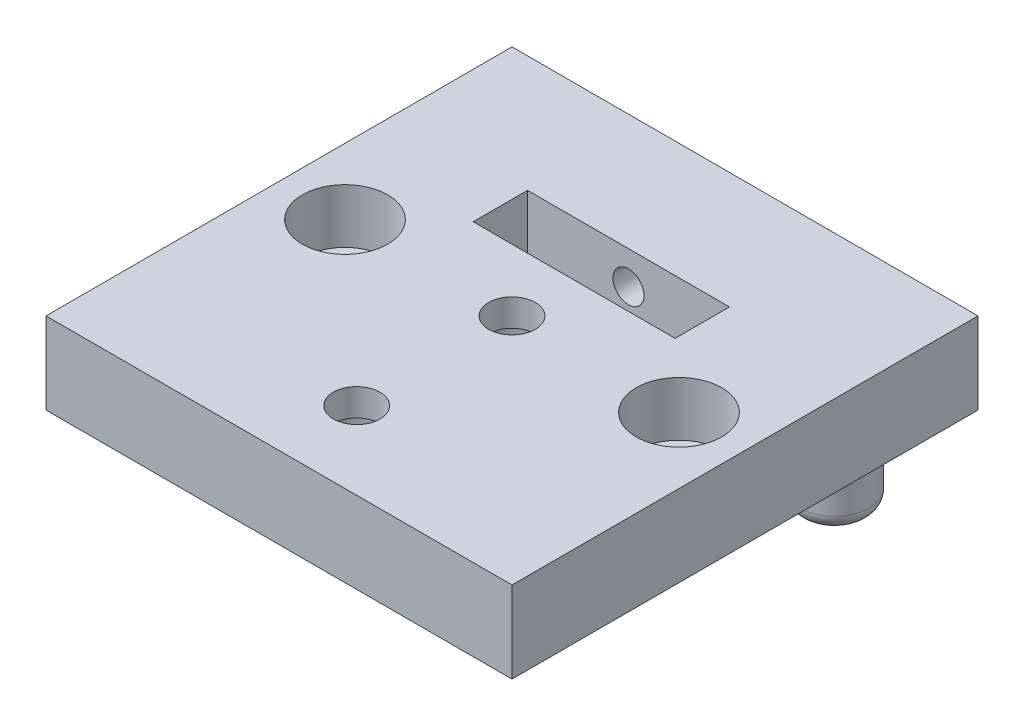
ISO-10303-21;
HEADER;
FILE_DESCRIPTION(('STEP AP214'),'2;1');
FILE_NAME('part.step','',(''),(''),'','','');
FILE_SCHEMA(('AUTOMOTIVE_DESIGN { 1 0 10303 214 1 1 1 1 }'));
ENDSEC;
DATA;
#1=APPLICATION_CONTEXT('core data for automotive mechanical design processes');
#2=APPLICATION_PROTOCOL_DEFINITION('international standard','automotive_design',2000,#1);
#3=PRODUCT_CONTEXT('',#1,'mechanical');
#4=PRODUCT('Part','Part','',(#3));
#5=PRODUCT_RELATED_PRODUCT_CATEGORY('part','',(#4));
#6=PRODUCT_DEFINITION_FORMATION('','',#4);
#7=PRODUCT_DEFINITION_CONTEXT('part definition',#1,'design');
#8=PRODUCT_DEFINITION('design','',#6,#7);
#9=PRODUCT_DEFINITION_SHAPE('','',#8);
#10=(LENGTH_UNIT() NAMED_UNIT(*) SI_UNIT(.MILLI.,.METRE.));
#11=(NAMED_UNIT(*) PLANE_ANGLE_UNIT() SI_UNIT($,.RADIAN.));
#12=(NAMED_UNIT(*) SI_UNIT($,.STERADIAN.) SOLID_ANGLE_UNIT());
#13=UNCERTAINTY_MEASURE_WITH_UNIT(LENGTH_MEASURE(1.E-05),#10,'distance_accuracy_value','');
#14=(GEOMETRIC_REPRESENTATION_CONTEXT(3) GLOBAL_UNCERTAINTY_ASSIGNED_CONTEXT((#13)) GLOBAL_UNIT_ASSIGNED_CONTEXT((#10,
#11,#12)) REPRESENTATION_CONTEXT('',''));
#15=CARTESIAN_POINT('',(0.,0.,0.));
#16=DIRECTION('',(0.,0.,1.));
#17=DIRECTION('',(1.,0.,0.));
#18=AXIS2_PLACEMENT_3D('',#15,#16,#17);
#19=CARTESIAN_POINT('',(0.,16.65,0.));
#20=DIRECTION('',(0.,-1.,0.));
#21=DIRECTION('',(0.,0.,-1.));
#22=AXIS2_PLACEMENT_3D('',#19,#20,#21);
#23=PLANE('',#22);
#24=CARTESIAN_POINT('',(10.75,16.65,-1.));
#25=DIRECTION('',(0.,-1.,0.));
#26=DIRECTION('',(0.,0.,-1.));
#27=AXIS2_PLACEMENT_3D('',#24,#25,#26);
#28=CIRCLE('',#27,2.25);
#29=CARTESIAN_POINT('',(10.75,16.65,1.25));
#30=VERTEX_POINT('',#29);
#31=EDGE_CURVE('E163',#30,#30,#28,.T.);
#32=ORIENTED_EDGE('',*,*,#31,.F.);
#33=EDGE_LOOP('',(#32));
#34=FACE_BOUND('',#33,.T.);
#35=CARTESIAN_POINT('',(-10.75,16.65,-1.));
#36=DIRECTION('',(0.,-1.,0.));
#37=DIRECTION('',(0.,0.,-1.));
#38=AXIS2_PLACEMENT_3D('',#35,#36,#37);
#39=CIRCLE('',#38,2.25);
#40=CARTESIAN_POINT('',(-10.75,16.65,1.25));
#41=VERTEX_POINT('',#40);
#42=EDGE_CURVE('E159',#41,#41,#39,.T.);
#43=ORIENTED_EDGE('',*,*,#42,.F.);
#44=EDGE_LOOP('',(#43));
#45=FACE_BOUND('',#44,.T.);
#46=DIRECTION('',(1.,0.,0.));
#47=VECTOR('',#46,1.);
#48=CARTESIAN_POINT('',(-26.7199111979548,16.65,24.));
#49=LINE('',#48,#47);
#50=CARTESIAN_POINT('',(-15.,16.65,24.));
#51=VERTEX_POINT('',#50);
#52=CARTESIAN_POINT('',(15.,16.65,24.));
#53=VERTEX_POINT('',#52);
#54=EDGE_CURVE('E55',#51,#53,#49,.T.);
#55=ORIENTED_EDGE('',*,*,#54,.F.);
#56=DIRECTION('',(0.,0.,1.));
#57=VECTOR('',#56,1.);
#58=CARTESIAN_POINT('',(-15.,16.65,1.5));
#59=LINE('',#58,#57);
#60=CARTESIAN_POINT('',(-15.,16.65,-6.));
#61=VERTEX_POINT('',#60);
#62=EDGE_CURVE('E158',#61,#51,#59,.T.);
#63=ORIENTED_EDGE('',*,*,#62,.F.);
#64=DIRECTION('',(1.,0.,0.));
#65=VECTOR('',#64,1.);
#66=CARTESIAN_POINT('',(0.,16.65,-6.));
#67=LINE('',#66,#65);
#68=CARTESIAN_POINT('',(15.,16.65,-6.));
#69=VERTEX_POINT('',#68);
#70=EDGE_CURVE('E132',#61,#69,#67,.T.);
#71=ORIENTED_EDGE('',*,*,#70,.T.);
#72=DIRECTION('',(0.,0.,1.));
#73=VECTOR('',#72,1.);
#74=CARTESIAN_POINT('',(15.,16.65,1.5));
#75=LINE('',#74,#73);
#76=EDGE_CURVE('E133',#69,#53,#75,.T.);
#77=ORIENTED_EDGE('',*,*,#76,.T.);
#78=EDGE_LOOP('',(#55,#63,#71,#77));
#79=FACE_BOUND('',#78,.T.);
#80=CARTESIAN_POINT('',(-10.7500000000011,16.65,8.9999999999896));
#81=DIRECTION('',(0.,-1.,0.));
#82=DIRECTION('',(0.,0.,-1.));
#83=AXIS2_PLACEMENT_3D('',#80,#81,#82);
#84=CIRCLE('',#83,1.5);
#85=CARTESIAN_POINT('',(-10.7500000000011,16.65,7.4999999999896));
#86=VERTEX_POINT('',#85);
#87=EDGE_CURVE('E138',#86,#86,#84,.F.);
#88=ORIENTED_EDGE('',*,*,#87,.T.);
#89=EDGE_LOOP('',(#88));
#90=FACE_BOUND('',#89,.T.);
#91=DIRECTION('',(0.,0.,1.));
#92=VECTOR('',#91,1.);
#93=CARTESIAN_POINT('',(6.5,16.65,1.5));
#94=LINE('',#93,#92);
#95=CARTESIAN_POINT('',(6.5,16.65,1.5));
#96=VERTEX_POINT('',#95);
#97=CARTESIAN_POINT('',(6.5,16.65,5.));
#98=VERTEX_POINT('',#97);
#99=EDGE_CURVE('E63',#96,#98,#94,.T.);
#100=ORIENTED_EDGE('',*,*,#99,.F.);
#101=DIRECTION('',(1.,0.,0.));
#102=VECTOR('',#101,1.);
#103=CARTESIAN_POINT('',(0.,16.65,1.5));
#104=LINE('',#103,#102);
#105=CARTESIAN_POINT('',(-6.5,16.65,1.5));
#106=VERTEX_POINT('',#105);
#107=EDGE_CURVE('E130',#106,#96,#104,.T.);
#108=ORIENTED_EDGE('',*,*,#107,.F.);
#109=DIRECTION('',(0.,0.,1.));
#110=VECTOR('',#109,1.);
#111=CARTESIAN_POINT('',(-6.5,16.65,1.5));
#112=LINE('',#111,#110);
#113=CARTESIAN_POINT('',(-6.5,16.65,5.));
#114=VERTEX_POINT('',#113);
#115=EDGE_CURVE('E120',#106,#114,#112,.T.);
#116=ORIENTED_EDGE('',*,*,#115,.T.);
#117=DIRECTION('',(1.,0.,0.));
#118=VECTOR('',#117,1.);
#119=CARTESIAN_POINT('',(-15.,16.65,5.));
#120=LINE('',#119,#118);
#121=EDGE_CURVE('E105',#114,#98,#120,.T.);
#122=ORIENTED_EDGE('',*,*,#121,.T.);
#123=EDGE_LOOP('',(#100,#108,#116,#122));
#124=FACE_BOUND('',#123,.T.);
#125=CARTESIAN_POINT('',(10.7500000000011,16.65,8.9999999999896));
#126=DIRECTION('',(0.,-1.,0.));
#127=DIRECTION('',(0.,0.,-1.));
#128=AXIS2_PLACEMENT_3D('',#125,#126,#127);
#129=CIRCLE('',#128,1.5);
#130=CARTESIAN_POINT('',(10.7500000000011,16.65,7.4999999999896));
#131=VERTEX_POINT('',#130);
#132=EDGE_CURVE('E140',#131,#131,#129,.F.);
#133=ORIENTED_EDGE('',*,*,#132,.T.);
#134=EDGE_LOOP('',(#133));
#135=FACE_BOUND('',#134,.T.);
#136=CARTESIAN_POINT('',(0.,16.65,19.));
#137=DIRECTION('',(0.,-1.,0.));
#138=DIRECTION('',(0.,0.,-1.));
#139=AXIS2_PLACEMENT_3D('',#136,#137,#138);
#140=CIRCLE('',#139,2.75);
#141=CARTESIAN_POINT('',(0.,16.65,16.25));
#142=VERTEX_POINT('',#141);
#143=EDGE_CURVE('E258',#142,#142,#140,.T.);
#144=ORIENTED_EDGE('',*,*,#143,.F.);
#145=EDGE_LOOP('',(#144));
#146=FACE_BOUND('',#145,.T.);
#147=CARTESIAN_POINT('',(1.04999478503709E-13,16.65,9.));
#148=DIRECTION('',(0.,-1.,0.));
#149=DIRECTION('',(0.,0.,-1.));
#150=AXIS2_PLACEMENT_3D('',#147,#148,#149);
#151=CIRCLE('',#150,2.75);
#152=CARTESIAN_POINT('',(1.04999478503709E-13,16.65,6.25));
#153=VERTEX_POINT('',#152);
#154=EDGE_CURVE('E261',#153,#153,#151,.T.);
#155=ORIENTED_EDGE('',*,*,#154,.F.);
#156=EDGE_LOOP('',(#155));
#157=FACE_BOUND('',#156,.T.);
#158=ADVANCED_FACE('F39',(#34,#45,#79,#90,#124,#135,#146,#157),#23,.T.);
#159=CARTESIAN_POINT('',(0.,0.,0.));
#160=DIRECTION('',(0.,0.,1.));
#161=DIRECTION('',(1.,0.,0.));
#162=AXIS2_PLACEMENT_3D('',#159,#160,#161);
#163=PLANE('',#162);
#164=CARTESIAN_POINT('',(0.,19.775,0.));
#165=DIRECTION('',(0.,0.,1.));
#166=DIRECTION('',(1.,0.,0.));
#167=AXIS2_PLACEMENT_3D('',#164,#165,#166);
#168=CIRCLE('',#167,1.);
#169=CARTESIAN_POINT('',(1.,19.775,0.));
#170=VERTEX_POINT('',#169);
#171=EDGE_CURVE('E347',#170,#170,#168,.F.);
#172=ORIENTED_EDGE('',*,*,#171,.F.);
#173=EDGE_LOOP('',(#172));
#174=FACE_BOUND('',#173,.T.);
#175=ADVANCED_FACE('F191',(#174),#163,.T.);
#176=CARTESIAN_POINT('',(1.04999478503709E-13,26.1426406871193,9.));
#177=DIRECTION('',(0.,-1.,0.));
#178=DIRECTION('',(0.,0.,-1.));
#179=AXIS2_PLACEMENT_3D('',#176,#177,#178);
#180=CYLINDRICAL_SURFACE('',#179,1.5);
#181=CARTESIAN_POINT('',(1.04999478503709E-13,20.15,9.));
#182=DIRECTION('',(0.,-1.,0.));
#183=DIRECTION('',(0.,0.,-1.));
#184=AXIS2_PLACEMENT_3D('',#181,#182,#183);
#185=CIRCLE('',#184,1.5);
#186=CARTESIAN_POINT('',(1.04999478503709E-13,20.15,7.5));
#187=VERTEX_POINT('',#186);
#188=EDGE_CURVE('E288',#187,#187,#185,.T.);
#189=ORIENTED_EDGE('',*,*,#188,.T.);
#190=EDGE_LOOP('',(#189));
#191=FACE_BOUND('',#190,.T.);
#192=CARTESIAN_POINT('',(1.04999478503709E-13,21.9,9.));
#193=DIRECTION('',(0.,1.,0.));
#194=DIRECTION('',(0.,0.,1.));
#195=AXIS2_PLACEMENT_3D('',#192,#193,#194);
#196=CIRCLE('',#195,1.5);
#197=CARTESIAN_POINT('',(1.04999478503709E-13,21.9,10.5));
#198=VERTEX_POINT('',#197);
#199=EDGE_CURVE('E284',#198,#198,#196,.F.);
#200=ORIENTED_EDGE('',*,*,#199,.F.);
#201=EDGE_LOOP('',(#200));
#202=FACE_BOUND('',#201,.T.);
#203=ADVANCED_FACE('F193',(#191,#202),#180,.F.);
#204=CARTESIAN_POINT('',(1.04999478503709E-13,20.15,9.));
#205=DIRECTION('',(0.,-1.,0.));
#206=DIRECTION('',(0.,0.,-1.));
#207=AXIS2_PLACEMENT_3D('',#204,#205,#206);
#208=PLANE('',#207);
#209=ORIENTED_EDGE('',*,*,#188,.F.);
#210=EDGE_LOOP('',(#209));
#211=FACE_BOUND('',#210,.T.);
#212=CARTESIAN_POINT('',(1.04999478503709E-13,20.15,9.));
#213=DIRECTION('',(0.,-1.,0.));
#214=DIRECTION('',(0.,0.,-1.));
#215=AXIS2_PLACEMENT_3D('',#212,#213,#214);
#216=CIRCLE('',#215,2.75);
#217=CARTESIAN_POINT('',(1.04999478503709E-13,20.15,6.25));
#218=VERTEX_POINT('',#217);
#219=EDGE_CURVE('E265',#218,#218,#216,.T.);
#220=ORIENTED_EDGE('',*,*,#219,.T.);
#221=EDGE_LOOP('',(#220));
#222=FACE_BOUND('',#221,.T.);
#223=ADVANCED_FACE('F200',(#211,#222),#208,.T.);
#224=CARTESIAN_POINT('',(1.04999478503709E-13,20.15,9.));
#225=DIRECTION('',(0.,-1.,0.));
#226=DIRECTION('',(0.,0.,-1.));
#227=AXIS2_PLACEMENT_3D('',#224,#225,#226);
#228=CYLINDRICAL_SURFACE('',#227,2.75);
#229=ORIENTED_EDGE('',*,*,#219,.F.);
#230=EDGE_LOOP('',(#229));
#231=FACE_BOUND('',#230,.T.);
#232=ORIENTED_EDGE('',*,*,#154,.T.);
#233=EDGE_LOOP('',(#232));
#234=FACE_BOUND('',#233,.T.);
#235=ADVANCED_FACE('F412',(#231,#234),#228,.F.);
#236=CARTESIAN_POINT('',(0.,26.1426406871193,19.));
#237=DIRECTION('',(0.,-1.,0.));
#238=DIRECTION('',(0.,0.,-1.));
#239=AXIS2_PLACEMENT_3D('',#236,#237,#238);
#240=CYLINDRICAL_SURFACE('',#239,1.5);
#241=CARTESIAN_POINT('',(0.,20.15,19.));
#242=DIRECTION('',(0.,-1.,0.));
#243=DIRECTION('',(0.,0.,-1.));
#244=AXIS2_PLACEMENT_3D('',#241,#242,#243);
#245=CIRCLE('',#244,1.5);
#246=CARTESIAN_POINT('',(0.,20.15,17.5));
#247=VERTEX_POINT('',#246);
#248=EDGE_CURVE('E270',#247,#247,#245,.T.);
#249=ORIENTED_EDGE('',*,*,#248,.T.);
#250=EDGE_LOOP('',(#249));
#251=FACE_BOUND('',#250,.T.);
#252=CARTESIAN_POINT('',(0.,21.9,19.));
#253=DIRECTION('',(0.,1.,0.));
#254=DIRECTION('',(0.,0.,1.));
#255=AXIS2_PLACEMENT_3D('',#252,#253,#254);
#256=CIRCLE('',#255,1.5);
#257=CARTESIAN_POINT('',(0.,21.9,20.5));
#258=VERTEX_POINT('',#257);
#259=EDGE_CURVE('E264',#258,#258,#256,.F.);
#260=ORIENTED_EDGE('',*,*,#259,.F.);
#261=EDGE_LOOP('',(#260));
#262=FACE_BOUND('',#261,.T.);
#263=ADVANCED_FACE('F415',(#251,#262),#240,.F.);
#264=CARTESIAN_POINT('',(0.,20.15,19.));
#265=DIRECTION('',(0.,-1.,0.));
#266=DIRECTION('',(0.,0.,-1.));
#267=AXIS2_PLACEMENT_3D('',#264,#265,#266);
#268=PLANE('',#267);
#269=ORIENTED_EDGE('',*,*,#248,.F.);
#270=EDGE_LOOP('',(#269));
#271=FACE_BOUND('',#270,.T.);
#272=CARTESIAN_POINT('',(0.,20.15,19.));
#273=DIRECTION('',(0.,-1.,0.));
#274=DIRECTION('',(0.,0.,-1.));
#275=AXIS2_PLACEMENT_3D('',#272,#273,#274);
#276=CIRCLE('',#275,2.75);
#277=CARTESIAN_POINT('',(0.,20.15,16.25));
#278=VERTEX_POINT('',#277);
#279=EDGE_CURVE('E280',#278,#278,#276,.T.);
#280=ORIENTED_EDGE('',*,*,#279,.T.);
#281=EDGE_LOOP('',(#280));
#282=FACE_BOUND('',#281,.T.);
#283=ADVANCED_FACE('F423',(#271,#282),#268,.T.);
#284=CARTESIAN_POINT('',(0.,20.15,19.));
#285=DIRECTION('',(0.,-1.,0.));
#286=DIRECTION('',(0.,0.,-1.));
#287=AXIS2_PLACEMENT_3D('',#284,#285,#286);
#288=CYLINDRICAL_SURFACE('',#287,2.75);
#289=ORIENTED_EDGE('',*,*,#279,.F.);
#290=EDGE_LOOP('',(#289));
#291=FACE_BOUND('',#290,.T.);
#292=ORIENTED_EDGE('',*,*,#143,.T.);
#293=EDGE_LOOP('',(#292));
#294=FACE_BOUND('',#293,.T.);
#295=ADVANCED_FACE('F420',(#291,#294),#288,.F.);
#296=CARTESIAN_POINT('',(10.7500000000011,18.4,8.9999999999896));
#297=DIRECTION('',(0.,1.,0.));
#298=DIRECTION('',(0.,0.,1.));
#299=AXIS2_PLACEMENT_3D('',#296,#297,#298);
#300=CYLINDRICAL_SURFACE('',#299,2.75);
#301=CARTESIAN_POINT('',(10.7500000000011,18.4,8.9999999999896));
#302=DIRECTION('',(0.,1.,0.));
#303=DIRECTION('',(0.,0.,-1.));
#304=AXIS2_PLACEMENT_3D('',#301,#302,#303);
#305=CIRCLE('',#304,2.75);
#306=CARTESIAN_POINT('',(10.7500000000011,18.4,6.2499999999896));
#307=VERTEX_POINT('',#306);
#308=EDGE_CURVE('E298',#307,#307,#305,.T.);
#309=ORIENTED_EDGE('',*,*,#308,.F.);
#310=EDGE_LOOP('',(#309));
#311=FACE_BOUND('',#310,.T.);
#312=CARTESIAN_POINT('',(10.7500000000011,21.9,8.9999999999896));
#313=DIRECTION('',(0.,1.,0.));
#314=DIRECTION('',(0.,0.,-1.));
#315=AXIS2_PLACEMENT_3D('',#312,#313,#314);
#316=CIRCLE('',#315,2.75);
#317=CARTESIAN_POINT('',(10.7500000000011,21.9,6.2499999999896));
#318=VERTEX_POINT('',#317);
#319=EDGE_CURVE('E164',#318,#318,#316,.T.);
#320=ORIENTED_EDGE('',*,*,#319,.T.);
#321=EDGE_LOOP('',(#320));
#322=FACE_BOUND('',#321,.T.);
#323=ADVANCED_FACE('F246',(#311,#322),#300,.F.);
#324=CARTESIAN_POINT('',(10.7500000000011,18.4,8.9999999999896));
#325=DIRECTION('',(0.,-1.,0.));
#326=DIRECTION('',(0.,0.,-1.));
#327=AXIS2_PLACEMENT_3D('',#324,#325,#326);
#328=PLANE('',#327);
#329=ORIENTED_EDGE('',*,*,#308,.T.);
#330=EDGE_LOOP('',(#329));
#331=FACE_BOUND('',#330,.T.);
#332=CARTESIAN_POINT('',(10.7500000000011,18.4,8.9999999999896));
#333=DIRECTION('',(0.,-1.,0.));
#334=DIRECTION('',(0.,0.,-1.));
#335=AXIS2_PLACEMENT_3D('',#332,#333,#334);
#336=CIRCLE('',#335,1.5);
#337=CARTESIAN_POINT('',(10.7500000000011,18.4,7.4999999999896));
#338=VERTEX_POINT('',#337);
#339=EDGE_CURVE('E252',#338,#338,#336,.F.);
#340=ORIENTED_EDGE('',*,*,#339,.F.);
#341=EDGE_LOOP('',(#340));
#342=FACE_BOUND('',#341,.T.);
#343=ADVANCED_FACE('F238',(#331,#342),#328,.F.);
#344=CARTESIAN_POINT('',(10.7500000000011,26.1426406871193,8.9999999999896));
#345=DIRECTION('',(0.,-1.,0.));
#346=DIRECTION('',(0.,0.,-1.));
#347=AXIS2_PLACEMENT_3D('',#344,#345,#346);
#348=CYLINDRICAL_SURFACE('',#347,1.5);
#349=ORIENTED_EDGE('',*,*,#339,.T.);
#350=EDGE_LOOP('',(#349));
#351=FACE_BOUND('',#350,.T.);
#352=ORIENTED_EDGE('',*,*,#132,.F.);
#353=EDGE_LOOP('',(#352));
#354=FACE_BOUND('',#353,.T.);
#355=ADVANCED_FACE('F236',(#351,#354),#348,.F.);
#356=CARTESIAN_POINT('',(-10.7500000000011,18.4,8.9999999999896));
#357=DIRECTION('',(0.,1.,0.));
#358=DIRECTION('',(0.,0.,1.));
#359=AXIS2_PLACEMENT_3D('',#356,#357,#358);
#360=CYLINDRICAL_SURFACE('',#359,2.75);
#361=CARTESIAN_POINT('',(-10.7500000000011,18.4,8.9999999999896));
#362=DIRECTION('',(0.,1.,0.));
#363=DIRECTION('',(0.,0.,1.));
#364=AXIS2_PLACEMENT_3D('',#361,#362,#363);
#365=CIRCLE('',#364,2.75);
#366=CARTESIAN_POINT('',(-10.7500000000011,18.4,11.7499999999896));
#367=VERTEX_POINT('',#366);
#368=EDGE_CURVE('E306',#367,#367,#365,.T.);
#369=ORIENTED_EDGE('',*,*,#368,.F.);
#370=EDGE_LOOP('',(#369));
#371=FACE_BOUND('',#370,.T.);
#372=CARTESIAN_POINT('',(-10.7500000000011,21.9,8.9999999999896));
#373=DIRECTION('',(0.,1.,0.));
#374=DIRECTION('',(0.,0.,1.));
#375=AXIS2_PLACEMENT_3D('',#372,#373,#374);
#376=CIRCLE('',#375,2.75);
#377=CARTESIAN_POINT('',(-10.7500000000011,21.9,11.7499999999896));
#378=VERTEX_POINT('',#377);
#379=EDGE_CURVE('E302',#378,#378,#376,.T.);
#380=ORIENTED_EDGE('',*,*,#379,.T.);
#381=EDGE_LOOP('',(#380));
#382=FACE_BOUND('',#381,.T.);
#383=ADVANCED_FACE('F220',(#371,#382),#360,.F.);
#384=CARTESIAN_POINT('',(0.,0.,-6.));
#385=DIRECTION('',(0.,0.,1.));
#386=DIRECTION('',(1.,0.,0.));
#387=AXIS2_PLACEMENT_3D('',#384,#385,#386);
#388=PLANE('',#387);
#389=ORIENTED_EDGE('',*,*,#70,.F.);
#390=DIRECTION('',(0.,1.,0.));
#391=VECTOR('',#390,1.);
#392=CARTESIAN_POINT('',(-15.,-10.6,-6.));
#393=LINE('',#392,#391);
#394=CARTESIAN_POINT('',(-15.,21.9,-6.));
#395=VERTEX_POINT('',#394);
#396=EDGE_CURVE('E147',#61,#395,#393,.T.);
#397=ORIENTED_EDGE('',*,*,#396,.T.);
#398=DIRECTION('',(1.,0.,0.));
#399=VECTOR('',#398,1.);
#400=CARTESIAN_POINT('',(15.,21.9,-6.));
#401=LINE('',#400,#399);
#402=CARTESIAN_POINT('',(15.,21.9,-6.));
#403=VERTEX_POINT('',#402);
#404=EDGE_CURVE('E151',#395,#403,#401,.T.);
#405=ORIENTED_EDGE('',*,*,#404,.T.);
#406=DIRECTION('',(0.,-1.,0.));
#407=VECTOR('',#406,1.);
#408=CARTESIAN_POINT('',(15.,-10.6,-6.));
#409=LINE('',#408,#407);
#410=EDGE_CURVE('E150',#403,#69,#409,.T.);
#411=ORIENTED_EDGE('',*,*,#410,.T.);
#412=EDGE_LOOP('',(#389,#397,#405,#411));
#413=FACE_BOUND('',#412,.T.);
#414=ADVANCED_FACE('F216',(#413),#388,.F.);
#415=CARTESIAN_POINT('',(0.,21.9,1.5));
#416=DIRECTION('',(0.,1.,0.));
#417=DIRECTION('',(0.,0.,1.));
#418=AXIS2_PLACEMENT_3D('',#415,#416,#417);
#419=PLANE('',#418);
#420=ORIENTED_EDGE('',*,*,#379,.F.);
#421=EDGE_LOOP('',(#420));
#422=FACE_BOUND('',#421,.T.);
#423=ORIENTED_EDGE('',*,*,#319,.F.);
#424=EDGE_LOOP('',(#423));
#425=FACE_BOUND('',#424,.T.);
#426=ORIENTED_EDGE('',*,*,#259,.T.);
#427=EDGE_LOOP('',(#426));
#428=FACE_BOUND('',#427,.T.);
#429=ORIENTED_EDGE('',*,*,#199,.T.);
#430=EDGE_LOOP('',(#429));
#431=FACE_BOUND('',#430,.T.);
#432=DIRECTION('',(0.,0.,-1.));
#433=VECTOR('',#432,1.);
#434=CARTESIAN_POINT('',(-15.,21.9,1.5));
#435=LINE('',#434,#433);
#436=CARTESIAN_POINT('',(-15.,21.9,24.));
#437=VERTEX_POINT('',#436);
#438=EDGE_CURVE('E342',#437,#395,#435,.T.);
#439=ORIENTED_EDGE('',*,*,#438,.F.);
#440=DIRECTION('',(-1.,0.,0.));
#441=VECTOR('',#440,1.);
#442=CARTESIAN_POINT('',(-15.,21.9,24.));
#443=LINE('',#442,#441);
#444=CARTESIAN_POINT('',(15.,21.9,24.));
#445=VERTEX_POINT('',#444);
#446=EDGE_CURVE('E371',#445,#437,#443,.T.);
#447=ORIENTED_EDGE('',*,*,#446,.F.);
#448=DIRECTION('',(0.,0.,-1.));
#449=VECTOR('',#448,1.);
#450=CARTESIAN_POINT('',(15.,21.9,1.5));
#451=LINE('',#450,#449);
#452=EDGE_CURVE('E157',#445,#403,#451,.T.);
#453=ORIENTED_EDGE('',*,*,#452,.T.);
#454=ORIENTED_EDGE('',*,*,#404,.F.);
#455=EDGE_LOOP('',(#439,#447,#453,#454));
#456=FACE_BOUND('',#455,.T.);
#457=DIRECTION('',(-1.,0.,0.));
#458=VECTOR('',#457,1.);
#459=CARTESIAN_POINT('',(-15.,21.9,5.));
#460=LINE('',#459,#458);
#461=CARTESIAN_POINT('',(6.5,21.9,5.));
#462=VERTEX_POINT('',#461);
#463=CARTESIAN_POINT('',(-6.5,21.9,5.));
#464=VERTEX_POINT('',#463);
#465=EDGE_CURVE('E115',#462,#464,#460,.T.);
#466=ORIENTED_EDGE('',*,*,#465,.T.);
#467=DIRECTION('',(0.,0.,-1.));
#468=VECTOR('',#467,1.);
#469=CARTESIAN_POINT('',(-6.5,21.9,5.));
#470=LINE('',#469,#468);
#471=CARTESIAN_POINT('',(-6.5,21.9,1.5));
#472=VERTEX_POINT('',#471);
#473=EDGE_CURVE('E123',#464,#472,#470,.T.);
#474=ORIENTED_EDGE('',*,*,#473,.T.);
#475=DIRECTION('',(1.,0.,0.));
#476=VECTOR('',#475,1.);
#477=CARTESIAN_POINT('',(0.,21.9,1.5));
#478=LINE('',#477,#476);
#479=CARTESIAN_POINT('',(6.5,21.9,1.5));
#480=VERTEX_POINT('',#479);
#481=EDGE_CURVE('E351',#472,#480,#478,.T.);
#482=ORIENTED_EDGE('',*,*,#481,.T.);
#483=DIRECTION('',(0.,0.,-1.));
#484=VECTOR('',#483,1.);
#485=CARTESIAN_POINT('',(6.5,21.9,5.));
#486=LINE('',#485,#484);
#487=EDGE_CURVE('E125',#462,#480,#486,.T.);
#488=ORIENTED_EDGE('',*,*,#487,.F.);
#489=EDGE_LOOP('',(#466,#474,#482,#488));
#490=FACE_BOUND('',#489,.T.);
#491=ADVANCED_FACE('F219',(#422,#425,#428,#431,#456,#490),#419,.T.);
#492=CARTESIAN_POINT('',(15.,0.,1.5));
#493=DIRECTION('',(-1.,0.,0.));
#494=DIRECTION('',(0.,0.,1.));
#495=AXIS2_PLACEMENT_3D('',#492,#493,#494);
#496=PLANE('',#495);
#497=ORIENTED_EDGE('',*,*,#76,.F.);
#498=ORIENTED_EDGE('',*,*,#410,.F.);
#499=ORIENTED_EDGE('',*,*,#452,.F.);
#500=DIRECTION('',(0.,1.,0.));
#501=VECTOR('',#500,1.);
#502=CARTESIAN_POINT('',(15.,21.9,24.));
#503=LINE('',#502,#501);
#504=EDGE_CURVE('E378',#53,#445,#503,.T.);
#505=ORIENTED_EDGE('',*,*,#504,.F.);
#506=EDGE_LOOP('',(#497,#498,#499,#505));
#507=FACE_BOUND('',#506,.T.);
#508=ADVANCED_FACE('F222',(#507),#496,.F.);
#509=CARTESIAN_POINT('',(-15.,0.,1.5));
#510=DIRECTION('',(-1.,0.,0.));
#511=DIRECTION('',(0.,0.,1.));
#512=AXIS2_PLACEMENT_3D('',#509,#510,#511);
#513=PLANE('',#512);
#514=ORIENTED_EDGE('',*,*,#396,.F.);
#515=ORIENTED_EDGE('',*,*,#62,.T.);
#516=DIRECTION('',(0.,-1.,0.));
#517=VECTOR('',#516,1.);
#518=CARTESIAN_POINT('',(-15.,21.9,24.));
#519=LINE('',#518,#517);
#520=EDGE_CURVE('E275',#437,#51,#519,.T.);
#521=ORIENTED_EDGE('',*,*,#520,.F.);
#522=ORIENTED_EDGE('',*,*,#438,.T.);
#523=EDGE_LOOP('',(#514,#515,#521,#522));
#524=FACE_BOUND('',#523,.T.);
#525=ADVANCED_FACE('F225',(#524),#513,.T.);
#526=CARTESIAN_POINT('',(0.,0.,24.));
#527=DIRECTION('',(0.,0.,1.));
#528=DIRECTION('',(1.,0.,0.));
#529=AXIS2_PLACEMENT_3D('',#526,#527,#528);
#530=PLANE('',#529);
#531=ORIENTED_EDGE('',*,*,#520,.T.);
#532=ORIENTED_EDGE('',*,*,#54,.T.);
#533=ORIENTED_EDGE('',*,*,#504,.T.);
#534=ORIENTED_EDGE('',*,*,#446,.T.);
#535=EDGE_LOOP('',(#531,#532,#533,#534));
#536=FACE_BOUND('',#535,.T.);
#537=ADVANCED_FACE('F232',(#536),#530,.T.);
#538=CARTESIAN_POINT('',(-6.5,0.,1.5));
#539=DIRECTION('',(-1.,0.,0.));
#540=DIRECTION('',(0.,0.,1.));
#541=AXIS2_PLACEMENT_3D('',#538,#539,#540);
#542=PLANE('',#541);
#543=ORIENTED_EDGE('',*,*,#115,.F.);
#544=DIRECTION('',(0.,1.,0.));
#545=VECTOR('',#544,1.);
#546=CARTESIAN_POINT('',(-6.5,21.9,1.5));
#547=LINE('',#546,#545);
#548=EDGE_CURVE('E154',#106,#472,#547,.T.);
#549=ORIENTED_EDGE('',*,*,#548,.T.);
#550=ORIENTED_EDGE('',*,*,#473,.F.);
#551=DIRECTION('',(0.,1.,0.));
#552=VECTOR('',#551,1.);
#553=CARTESIAN_POINT('',(-6.5,21.9,5.));
#554=LINE('',#553,#552);
#555=EDGE_CURVE('E109',#114,#464,#554,.T.);
#556=ORIENTED_EDGE('',*,*,#555,.F.);
#557=EDGE_LOOP('',(#543,#549,#550,#556));
#558=FACE_BOUND('',#557,.T.);
#559=ADVANCED_FACE('F118',(#558),#542,.F.);
#560=CARTESIAN_POINT('',(6.5,0.,1.5));
#561=DIRECTION('',(-1.,0.,0.));
#562=DIRECTION('',(0.,0.,1.));
#563=AXIS2_PLACEMENT_3D('',#560,#561,#562);
#564=PLANE('',#563);
#565=DIRECTION('',(0.,-1.,0.));
#566=VECTOR('',#565,1.);
#567=CARTESIAN_POINT('',(6.5,-10.6,1.5));
#568=LINE('',#567,#566);
#569=EDGE_CURVE('E368',#480,#96,#568,.T.);
#570=ORIENTED_EDGE('',*,*,#569,.T.);
#571=ORIENTED_EDGE('',*,*,#99,.T.);
#572=DIRECTION('',(0.,-1.,0.));
#573=VECTOR('',#572,1.);
#574=CARTESIAN_POINT('',(6.5,-10.6,5.));
#575=LINE('',#574,#573);
#576=EDGE_CURVE('E111',#462,#98,#575,.T.);
#577=ORIENTED_EDGE('',*,*,#576,.F.);
#578=ORIENTED_EDGE('',*,*,#487,.T.);
#579=EDGE_LOOP('',(#570,#571,#577,#578));
#580=FACE_BOUND('',#579,.T.);
#581=ADVANCED_FACE('F227',(#580),#564,.T.);
#582=CARTESIAN_POINT('',(0.,0.,5.));
#583=DIRECTION('',(0.,0.,1.));
#584=DIRECTION('',(1.,0.,0.));
#585=AXIS2_PLACEMENT_3D('',#582,#583,#584);
#586=PLANE('',#585);
#587=ORIENTED_EDGE('',*,*,#576,.T.);
#588=ORIENTED_EDGE('',*,*,#121,.F.);
#589=ORIENTED_EDGE('',*,*,#555,.T.);
#590=ORIENTED_EDGE('',*,*,#465,.F.);
#591=EDGE_LOOP('',(#587,#588,#589,#590));
#592=FACE_BOUND('',#591,.T.);
#593=ADVANCED_FACE('F107',(#592),#586,.F.);
#594=CARTESIAN_POINT('',(0.,19.775,1.5));
#595=DIRECTION('',(0.,0.,-1.));
#596=DIRECTION('',(-1.,0.,0.));
#597=AXIS2_PLACEMENT_3D('',#594,#595,#596);
#598=CYLINDRICAL_SURFACE('',#597,1.);
#599=CARTESIAN_POINT('',(0.,19.775,1.5));
#600=DIRECTION('',(0.,0.,1.));
#601=DIRECTION('',(1.,0.,0.));
#602=AXIS2_PLACEMENT_3D('',#599,#600,#601);
#603=CIRCLE('',#602,1.);
#604=CARTESIAN_POINT('',(1.,19.775,1.5));
#605=VERTEX_POINT('',#604);
#606=EDGE_CURVE('E346',#605,#605,#603,.F.);
#607=ORIENTED_EDGE('',*,*,#606,.F.);
#608=EDGE_LOOP('',(#607));
#609=FACE_BOUND('',#608,.T.);
#610=ORIENTED_EDGE('',*,*,#171,.T.);
#611=EDGE_LOOP('',(#610));
#612=FACE_BOUND('',#611,.T.);
#613=ADVANCED_FACE('F214',(#609,#612),#598,.F.);
#614=CARTESIAN_POINT('',(0.,0.,1.5));
#615=DIRECTION('',(0.,0.,1.));
#616=DIRECTION('',(1.,0.,0.));
#617=AXIS2_PLACEMENT_3D('',#614,#615,#616);
#618=PLANE('',#617);
#619=ORIENTED_EDGE('',*,*,#606,.T.);
#620=EDGE_LOOP('',(#619));
#621=FACE_BOUND('',#620,.T.);
#622=ORIENTED_EDGE('',*,*,#107,.T.);
#623=ORIENTED_EDGE('',*,*,#569,.F.);
#624=ORIENTED_EDGE('',*,*,#481,.F.);
#625=ORIENTED_EDGE('',*,*,#548,.F.);
#626=EDGE_LOOP('',(#622,#623,#624,#625));
#627=FACE_BOUND('',#626,.T.);
#628=ADVANCED_FACE('F210',(#621,#627),#618,.T.);
#629=CARTESIAN_POINT('',(-10.7500000000011,18.4,8.9999999999896));
#630=DIRECTION('',(0.,1.,0.));
#631=DIRECTION('',(0.,0.,1.));
#632=AXIS2_PLACEMENT_3D('',#629,#630,#631);
#633=PLANE('',#632);
#634=ORIENTED_EDGE('',*,*,#368,.T.);
#635=EDGE_LOOP('',(#634));
#636=FACE_BOUND('',#635,.T.);
#637=CARTESIAN_POINT('',(-10.7500000000011,18.4,8.9999999999896));
#638=DIRECTION('',(0.,1.,0.));
#639=DIRECTION('',(0.,0.,1.));
#640=AXIS2_PLACEMENT_3D('',#637,#638,#639);
#641=CIRCLE('',#640,1.5);
#642=CARTESIAN_POINT('',(-10.7500000000011,18.4,10.4999999999896));
#643=VERTEX_POINT('',#642);
#644=EDGE_CURVE('E310',#643,#643,#641,.F.);
#645=ORIENTED_EDGE('',*,*,#644,.T.);
#646=EDGE_LOOP('',(#645));
#647=FACE_BOUND('',#646,.T.);
#648=ADVANCED_FACE('F213',(#636,#647),#633,.T.);
#649=CARTESIAN_POINT('',(-10.7500000000011,26.1426406871193,8.9999999999896));
#650=DIRECTION('',(0.,-1.,0.));
#651=DIRECTION('',(0.,0.,-1.));
#652=AXIS2_PLACEMENT_3D('',#649,#650,#651);
#653=CYLINDRICAL_SURFACE('',#652,1.5);
#654=ORIENTED_EDGE('',*,*,#644,.F.);
#655=EDGE_LOOP('',(#654));
#656=FACE_BOUND('',#655,.T.);
#657=ORIENTED_EDGE('',*,*,#87,.F.);
#658=EDGE_LOOP('',(#657));
#659=FACE_BOUND('',#658,.T.);
#660=ADVANCED_FACE('F206',(#656,#659),#653,.F.);
#661=CARTESIAN_POINT('',(-10.75,11.7,-1.));
#662=DIRECTION('',(0.,1.,0.));
#663=DIRECTION('',(0.,0.,1.));
#664=AXIS2_PLACEMENT_3D('',#661,#662,#663);
#665=CYLINDRICAL_SURFACE('',#664,2.25);
#666=CARTESIAN_POINT('',(-10.75,12.7,-1.));
#667=DIRECTION('',(0.,1.,0.));
#668=DIRECTION('',(0.,0.,1.));
#669=AXIS2_PLACEMENT_3D('',#666,#667,#668);
#670=CIRCLE('',#669,2.25);
#671=CARTESIAN_POINT('',(-10.75,12.7,1.25));
#672=VERTEX_POINT('',#671);
#673=EDGE_CURVE('E168',#672,#672,#670,.T.);
#674=CARTESIAN_POINT('',(-10.75,12.7,1.25));
#675=CARTESIAN_POINT('',(-10.75,12.7411458333333,1.25));
#676=CARTESIAN_POINT('',(-10.75,12.7822916666667,1.25));
#677=CARTESIAN_POINT('',(-10.75,12.8645833333333,1.25));
#678=CARTESIAN_POINT('',(-10.75,12.9057291666667,1.25));
#679=CARTESIAN_POINT('',(-10.75,12.9880208333333,1.25));
#680=CARTESIAN_POINT('',(-10.75,13.0291666666667,1.25));
#681=CARTESIAN_POINT('',(-10.75,13.1114583333333,1.25));
#682=CARTESIAN_POINT('',(-10.75,13.1526041666667,1.25));
#683=CARTESIAN_POINT('',(-10.75,13.2348958333333,1.25));
#684=CARTESIAN_POINT('',(-10.75,13.2760416666667,1.25));
#685=CARTESIAN_POINT('',(-10.75,13.3583333333333,1.25));
#686=CARTESIAN_POINT('',(-10.75,13.3994791666667,1.25));
#687=CARTESIAN_POINT('',(-10.75,13.4817708333333,1.25));
#688=CARTESIAN_POINT('',(-10.75,13.5229166666667,1.25));
#689=CARTESIAN_POINT('',(-10.75,13.6052083333333,1.25));
#690=CARTESIAN_POINT('',(-10.75,13.6463541666667,1.25));
#691=CARTESIAN_POINT('',(-10.75,13.7286458333333,1.25));
#692=CARTESIAN_POINT('',(-10.75,13.7697916666667,1.25));
#693=CARTESIAN_POINT('',(-10.75,13.8520833333333,1.25));
#694=CARTESIAN_POINT('',(-10.75,13.8932291666667,1.25));
#695=CARTESIAN_POINT('',(-10.75,13.9755208333333,1.25));
#696=CARTESIAN_POINT('',(-10.75,14.0166666666667,1.25));
#697=CARTESIAN_POINT('',(-10.75,14.0989583333333,1.25));
#698=CARTESIAN_POINT('',(-10.75,14.1401041666667,1.25));
#699=CARTESIAN_POINT('',(-10.75,14.2223958333333,1.25));
#700=CARTESIAN_POINT('',(-10.75,14.2635416666667,1.25));
#701=CARTESIAN_POINT('',(-10.75,14.3458333333333,1.25));
#702=CARTESIAN_POINT('',(-10.75,14.3869791666667,1.25));
#703=CARTESIAN_POINT('',(-10.75,14.4692708333333,1.25));
#704=CARTESIAN_POINT('',(-10.75,14.5104166666667,1.25));
#705=CARTESIAN_POINT('',(-10.75,14.5927083333333,1.25));
#706=CARTESIAN_POINT('',(-10.75,14.6338541666667,1.25));
#707=CARTESIAN_POINT('',(-10.75,14.7161458333333,1.25));
#708=CARTESIAN_POINT('',(-10.75,14.7572916666667,1.25));
#709=CARTESIAN_POINT('',(-10.75,14.8395833333333,1.25));
#710=CARTESIAN_POINT('',(-10.75,14.8807291666667,1.25));
#711=CARTESIAN_POINT('',(-10.75,14.9630208333333,1.25));
#712=CARTESIAN_POINT('',(-10.75,15.0041666666667,1.25));
#713=CARTESIAN_POINT('',(-10.75,15.0864583333333,1.25));
#714=CARTESIAN_POINT('',(-10.75,15.1276041666667,1.25));
#715=CARTESIAN_POINT('',(-10.75,15.2098958333333,1.25));
#716=CARTESIAN_POINT('',(-10.75,15.2510416666667,1.25));
#717=CARTESIAN_POINT('',(-10.75,15.3333333333333,1.25));
#718=CARTESIAN_POINT('',(-10.75,15.3744791666667,1.25));
#719=CARTESIAN_POINT('',(-10.75,15.4567708333333,1.25));
#720=CARTESIAN_POINT('',(-10.75,15.4979166666667,1.25));
#721=CARTESIAN_POINT('',(-10.75,15.5802083333333,1.25));
#722=CARTESIAN_POINT('',(-10.75,15.6213541666667,1.25));
#723=CARTESIAN_POINT('',(-10.75,15.7036458333333,1.25));
#724=CARTESIAN_POINT('',(-10.75,15.7447916666667,1.25));
#725=CARTESIAN_POINT('',(-10.75,15.8270833333333,1.25));
#726=CARTESIAN_POINT('',(-10.75,15.8682291666667,1.25));
#727=CARTESIAN_POINT('',(-10.75,15.9505208333333,1.25));
#728=CARTESIAN_POINT('',(-10.75,15.9916666666667,1.25));
#729=CARTESIAN_POINT('',(-10.75,16.0739583333333,1.25));
#730=CARTESIAN_POINT('',(-10.75,16.1151041666667,1.25));
#731=CARTESIAN_POINT('',(-10.75,16.1973958333333,1.25));
#732=CARTESIAN_POINT('',(-10.75,16.2385416666667,1.25));
#733=CARTESIAN_POINT('',(-10.75,16.3208333333333,1.25));
#734=CARTESIAN_POINT('',(-10.75,16.3619791666667,1.25));
#735=CARTESIAN_POINT('',(-10.75,16.4442708333333,1.25));
#736=CARTESIAN_POINT('',(-10.75,16.4854166666667,1.25));
#737=CARTESIAN_POINT('',(-10.75,16.5677083333333,1.25));
#738=CARTESIAN_POINT('',(-10.75,16.6088541666667,1.25));
#739=CARTESIAN_POINT('',(-10.75,16.65,1.25));
#740=B_SPLINE_CURVE_WITH_KNOTS('',3,(#674,#675,#676,#677,#678,#679,#680,#681,#682,#683,#684,
#685,#686,#687,#688,#689,#690,#691,#692,#693,#694,#695,#696,#697,#698,#699,#700,#701,#702,#703,
#704,#705,#706,#707,#708,#709,#710,#711,#712,#713,#714,#715,#716,#717,#718,#719,#720,#721,#722,
#723,#724,#725,#726,#727,#728,#729,#730,#731,#732,#733,#734,#735,#736,#737,#738,#739),
.UNSPECIFIED.,.F.,.F.,(4,2,2,2,2,2,2,2,2,2,2,2,2,2,2,2,2,2,2,2,2,2,2,2,2,2,2,2,2,2,2,2,4),(0.,
0.1234375,0.246875000000001,0.370312500000001,0.493750000000001,0.617187500000001,
0.740625000000002,0.864062500000002,0.9875,1.1109375,1.234375,1.3578125,1.48125,1.6046875,
1.728125,1.8515625,1.975,2.0984375,2.221875,2.3453125,2.46875,2.5921875,2.715625,2.8390625,
2.9625,3.0859375,3.209375,3.3328125,3.45625,3.5796875,3.703125,3.8265625,3.95),.UNSPECIFIED.);
#741=EDGE_CURVE('BSEAM205',#672,#41,#740,.T.);
#742=ORIENTED_EDGE('',*,*,#673,.T.);
#743=ORIENTED_EDGE('',*,*,#42,.T.);
#744=ORIENTED_EDGE('',*,*,#741,.T.);
#745=ORIENTED_EDGE('',*,*,#741,.F.);
#746=EDGE_LOOP('',(#742,#744,#743,#745));
#747=FACE_BOUND('',#746,.T.);
#748=ADVANCED_FACE('F205',(#747),#665,.T.);
#749=CARTESIAN_POINT('',(-10.75,11.7,-1.));
#750=DIRECTION('',(0.,1.,0.));
#751=DIRECTION('',(0.,0.,1.));
#752=AXIS2_PLACEMENT_3D('',#749,#750,#751);
#753=PLANE('',#752);
#754=CARTESIAN_POINT('',(-10.75,11.7,-1.));
#755=DIRECTION('',(0.,1.,0.));
#756=DIRECTION('',(0.,0.,1.));
#757=AXIS2_PLACEMENT_3D('',#754,#755,#756);
#758=CIRCLE('',#757,1.25);
#759=CARTESIAN_POINT('',(-10.75,11.7,0.250000000000001));
#760=VERTEX_POINT('',#759);
#761=EDGE_CURVE('E172',#760,#760,#758,.F.);
#762=ORIENTED_EDGE('',*,*,#761,.T.);
#763=EDGE_LOOP('',(#762));
#764=FACE_BOUND('',#763,.T.);
#765=ADVANCED_FACE('F327',(#764),#753,.F.);
#766=CARTESIAN_POINT('',(10.75,11.7,-1.));
#767=DIRECTION('',(0.,1.,0.));
#768=DIRECTION('',(0.,0.,1.));
#769=AXIS2_PLACEMENT_3D('',#766,#767,#768);
#770=CYLINDRICAL_SURFACE('',#769,2.25);
#771=CARTESIAN_POINT('',(10.75,12.7,-1.));
#772=DIRECTION('',(0.,-1.,0.));
#773=DIRECTION('',(0.,0.,-1.));
#774=AXIS2_PLACEMENT_3D('',#771,#772,#773);
#775=CIRCLE('',#774,2.25);
#776=CARTESIAN_POINT('',(10.75,12.7,1.25));
#777=VERTEX_POINT('',#776);
#778=EDGE_CURVE('E48',#777,#777,#775,.F.);
#779=CARTESIAN_POINT('',(10.75,12.7,1.25));
#780=CARTESIAN_POINT('',(10.75,12.7411458333333,1.25));
#781=CARTESIAN_POINT('',(10.75,12.7822916666667,1.25));
#782=CARTESIAN_POINT('',(10.75,12.8645833333333,1.25));
#783=CARTESIAN_POINT('',(10.75,12.9057291666667,1.25));
#784=CARTESIAN_POINT('',(10.75,12.9880208333333,1.25));
#785=CARTESIAN_POINT('',(10.75,13.0291666666667,1.25));
#786=CARTESIAN_POINT('',(10.75,13.1114583333333,1.25));
#787=CARTESIAN_POINT('',(10.75,13.1526041666667,1.25));
#788=CARTESIAN_POINT('',(10.75,13.2348958333333,1.25));
#789=CARTESIAN_POINT('',(10.75,13.2760416666667,1.25));
#790=CARTESIAN_POINT('',(10.75,13.3583333333333,1.25));
#791=CARTESIAN_POINT('',(10.75,13.3994791666667,1.25));
#792=CARTESIAN_POINT('',(10.75,13.4817708333333,1.25));
#793=CARTESIAN_POINT('',(10.75,13.5229166666667,1.25));
#794=CARTESIAN_POINT('',(10.75,13.6052083333333,1.25));
#795=CARTESIAN_POINT('',(10.75,13.6463541666667,1.25));
#796=CARTESIAN_POINT('',(10.75,13.7286458333333,1.25));
#797=CARTESIAN_POINT('',(10.75,13.7697916666667,1.25));
#798=CARTESIAN_POINT('',(10.75,13.8520833333333,1.25));
#799=CARTESIAN_POINT('',(10.75,13.8932291666667,1.25));
#800=CARTESIAN_POINT('',(10.75,13.9755208333333,1.25));
#801=CARTESIAN_POINT('',(10.75,14.0166666666667,1.25));
#802=CARTESIAN_POINT('',(10.75,14.0989583333333,1.25));
#803=CARTESIAN_POINT('',(10.75,14.1401041666667,1.25));
#804=CARTESIAN_POINT('',(10.75,14.2223958333333,1.25));
#805=CARTESIAN_POINT('',(10.75,14.2635416666667,1.25));
#806=CARTESIAN_POINT('',(10.75,14.3458333333333,1.25));
#807=CARTESIAN_POINT('',(10.75,14.3869791666667,1.25));
#808=CARTESIAN_POINT('',(10.75,14.4692708333333,1.25));
#809=CARTESIAN_POINT('',(10.75,14.5104166666667,1.25));
#810=CARTESIAN_POINT('',(10.75,14.5927083333333,1.25));
#811=CARTESIAN_POINT('',(10.75,14.6338541666667,1.25));
#812=CARTESIAN_POINT('',(10.75,14.7161458333333,1.25));
#813=CARTESIAN_POINT('',(10.75,14.7572916666667,1.25));
#814=CARTESIAN_POINT('',(10.75,14.8395833333333,1.25));
#815=CARTESIAN_POINT('',(10.75,14.8807291666667,1.25));
#816=CARTESIAN_POINT('',(10.75,14.9630208333333,1.25));
#817=CARTESIAN_POINT('',(10.75,15.0041666666667,1.25));
#818=CARTESIAN_POINT('',(10.75,15.0864583333333,1.25));
#819=CARTESIAN_POINT('',(10.75,15.1276041666667,1.25));
#820=CARTESIAN_POINT('',(10.75,15.2098958333333,1.25));
#821=CARTESIAN_POINT('',(10.75,15.2510416666667,1.25));
#822=CARTESIAN_POINT('',(10.75,15.3333333333333,1.25));
#823=CARTESIAN_POINT('',(10.75,15.3744791666667,1.25));
#824=CARTESIAN_POINT('',(10.75,15.4567708333333,1.25));
#825=CARTESIAN_POINT('',(10.75,15.4979166666667,1.25));
#826=CARTESIAN_POINT('',(10.75,15.5802083333333,1.25));
#827=CARTESIAN_POINT('',(10.75,15.6213541666667,1.25));
#828=CARTESIAN_POINT('',(10.75,15.7036458333333,1.25));
#829=CARTESIAN_POINT('',(10.75,15.7447916666667,1.25));
#830=CARTESIAN_POINT('',(10.75,15.8270833333333,1.25));
#831=CARTESIAN_POINT('',(10.75,15.8682291666667,1.25));
#832=CARTESIAN_POINT('',(10.75,15.9505208333333,1.25));
#833=CARTESIAN_POINT('',(10.75,15.9916666666667,1.25));
#834=CARTESIAN_POINT('',(10.75,16.0739583333333,1.25));
#835=CARTESIAN_POINT('',(10.75,16.1151041666667,1.25));
#836=CARTESIAN_POINT('',(10.75,16.1973958333333,1.25));
#837=CARTESIAN_POINT('',(10.75,16.2385416666667,1.25));
#838=CARTESIAN_POINT('',(10.75,16.3208333333333,1.25));
#839=CARTESIAN_POINT('',(10.75,16.3619791666667,1.25));
#840=CARTESIAN_POINT('',(10.75,16.4442708333333,1.25));
#841=CARTESIAN_POINT('',(10.75,16.4854166666667,1.25));
#842=CARTESIAN_POINT('',(10.75,16.5677083333333,1.25));
#843=CARTESIAN_POINT('',(10.75,16.6088541666667,1.25));
#844=CARTESIAN_POINT('',(10.75,16.65,1.25));
#845=B_SPLINE_CURVE_WITH_KNOTS('',3,(#779,#780,#781,#782,#783,#784,#785,#786,#787,#788,#789,
#790,#791,#792,#793,#794,#795,#796,#797,#798,#799,#800,#801,#802,#803,#804,#805,#806,#807,#808,
#809,#810,#811,#812,#813,#814,#815,#816,#817,#818,#819,#820,#821,#822,#823,#824,#825,#826,#827,
#828,#829,#830,#831,#832,#833,#834,#835,#836,#837,#838,#839,#840,#841,#842,#843,#844),
.UNSPECIFIED.,.F.,.F.,(4,2,2,2,2,2,2,2,2,2,2,2,2,2,2,2,2,2,2,2,2,2,2,2,2,2,2,2,2,2,2,2,4),(0.,
0.123437499999999,0.246874999999999,0.370312499999999,0.493749999999999,0.6171875,0.740625,
0.8640625,0.987499999999999,1.1109375,1.234375,1.3578125,1.48125,1.6046875,1.728125,1.8515625,
1.975,2.0984375,2.221875,2.3453125,2.46875,2.5921875,2.715625,2.8390625,2.9625,3.0859375,
3.209375,3.3328125,3.45625,3.5796875,3.703125,3.8265625,3.95),.UNSPECIFIED.);
#846=EDGE_CURVE('BSEAM179',#777,#30,#845,.T.);
#847=ORIENTED_EDGE('',*,*,#778,.T.);
#848=ORIENTED_EDGE('',*,*,#31,.T.);
#849=ORIENTED_EDGE('',*,*,#846,.T.);
#850=ORIENTED_EDGE('',*,*,#846,.F.);
#851=EDGE_LOOP('',(#847,#849,#848,#850));
#852=FACE_BOUND('',#851,.T.);
#853=ADVANCED_FACE('F179',(#852),#770,.T.);
#854=CARTESIAN_POINT('',(10.75,11.7,-1.));
#855=DIRECTION('',(0.,-1.,0.));
#856=DIRECTION('',(0.,0.,-1.));
#857=AXIS2_PLACEMENT_3D('',#854,#855,#856);
#858=PLANE('',#857);
#859=CARTESIAN_POINT('',(10.75,11.7,-1.));
#860=DIRECTION('',(0.,-1.,0.));
#861=DIRECTION('',(0.,0.,-1.));
#862=AXIS2_PLACEMENT_3D('',#859,#860,#861);
#863=CIRCLE('',#862,1.25);
#864=CARTESIAN_POINT('',(10.75,11.7,-2.25));
#865=VERTEX_POINT('',#864);
#866=EDGE_CURVE('E11',#865,#865,#863,.T.);
#867=ORIENTED_EDGE('',*,*,#866,.T.);
#868=EDGE_LOOP('',(#867));
#869=FACE_BOUND('',#868,.T.);
#870=ADVANCED_FACE('F188',(#869),#858,.T.);
#871=CARTESIAN_POINT('',(-10.75,12.7,-1.));
#872=DIRECTION('',(0.,1.,0.));
#873=DIRECTION('',(0.,0.,1.));
#874=AXIS2_PLACEMENT_3D('',#871,#872,#873);
#875=TOROIDAL_SURFACE('',#874,1.25,1.);
#876=ORIENTED_EDGE('',*,*,#761,.F.);
#877=EDGE_LOOP('',(#876));
#878=FACE_BOUND('',#877,.T.);
#879=ORIENTED_EDGE('',*,*,#673,.F.);
#880=EDGE_LOOP('',(#879));
#881=FACE_BOUND('',#880,.T.);
#882=ADVANCED_FACE('F183',(#878,#881),#875,.T.);
#883=CARTESIAN_POINT('',(10.75,12.7,-1.));
#884=DIRECTION('',(0.,-1.,0.));
#885=DIRECTION('',(0.,0.,-1.));
#886=AXIS2_PLACEMENT_3D('',#883,#884,#885);
#887=TOROIDAL_SURFACE('',#886,1.25,1.);
#888=ORIENTED_EDGE('',*,*,#866,.F.);
#889=EDGE_LOOP('',(#888));
#890=FACE_BOUND('',#889,.T.);
#891=ORIENTED_EDGE('',*,*,#778,.F.);
#892=EDGE_LOOP('',(#891));
#893=FACE_BOUND('',#892,.T.);
#894=ADVANCED_FACE('F41',(#890,#893),#887,.T.);
#895=CLOSED_SHELL('',(#158,#175,#203,#223,#235,#263,#283,#295,#323,#343,#355,#383,#414,#491,
#508,#525,#537,#559,#581,#593,#613,#628,#648,#660,#748,#765,#853,#870,#882,#894));
#896=MANIFOLD_SOLID_BREP('B2',#895);
#897=ADVANCED_BREP_SHAPE_REPRESENTATION('',(#18,#896),#14);
#898=SHAPE_DEFINITION_REPRESENTATION(#9,#897);
ENDSEC;
END-ISO-10303-21;
